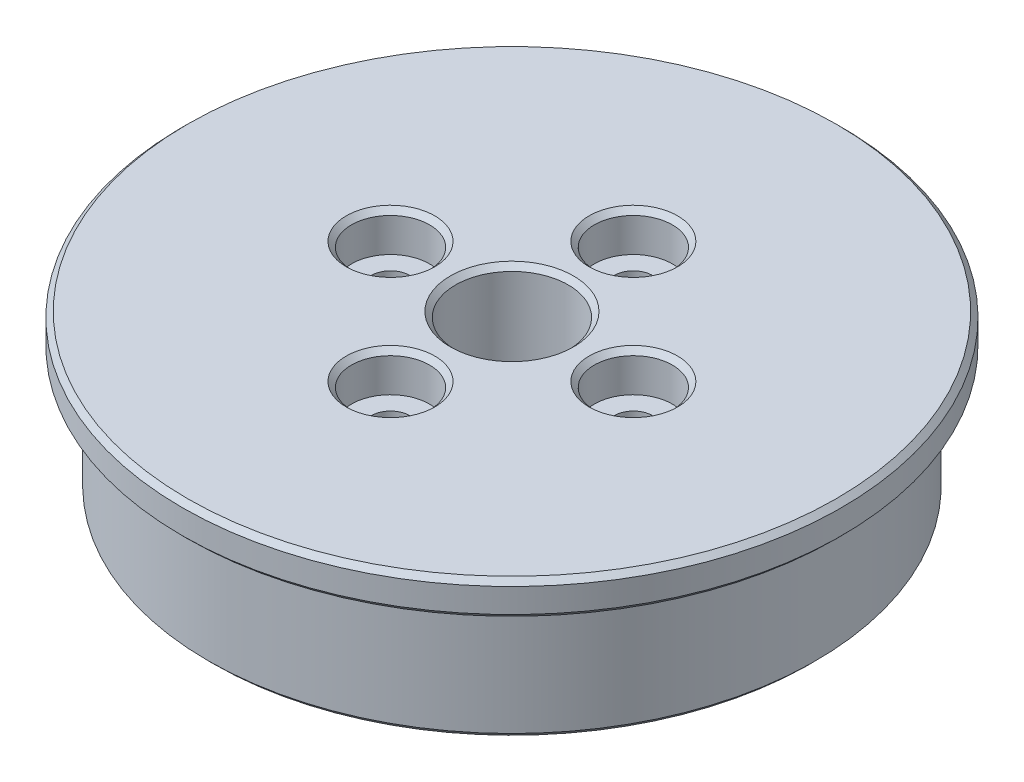
ISO-10303-21;
HEADER;
FILE_DESCRIPTION(('STEP AP214'),'2;1');
FILE_NAME('part.step','',(''),(''),'','','');
FILE_SCHEMA(('AUTOMOTIVE_DESIGN { 1 0 10303 214 1 1 1 1 }'));
ENDSEC;
DATA;
#1=APPLICATION_CONTEXT('core data for automotive mechanical design processes');
#2=APPLICATION_PROTOCOL_DEFINITION('international standard','automotive_design',2000,#1);
#3=PRODUCT_CONTEXT('',#1,'mechanical');
#4=PRODUCT('Part','Part','',(#3));
#5=PRODUCT_RELATED_PRODUCT_CATEGORY('part','',(#4));
#6=PRODUCT_DEFINITION_FORMATION('','',#4);
#7=PRODUCT_DEFINITION_CONTEXT('part definition',#1,'design');
#8=PRODUCT_DEFINITION('design','',#6,#7);
#9=PRODUCT_DEFINITION_SHAPE('','',#8);
#10=(LENGTH_UNIT() NAMED_UNIT(*) SI_UNIT(.MILLI.,.METRE.));
#11=(NAMED_UNIT(*) PLANE_ANGLE_UNIT() SI_UNIT($,.RADIAN.));
#12=(NAMED_UNIT(*) SI_UNIT($,.STERADIAN.) SOLID_ANGLE_UNIT());
#13=UNCERTAINTY_MEASURE_WITH_UNIT(LENGTH_MEASURE(1.E-05),#10,'distance_accuracy_value','');
#14=(GEOMETRIC_REPRESENTATION_CONTEXT(3) GLOBAL_UNCERTAINTY_ASSIGNED_CONTEXT((#13)) GLOBAL_UNIT_ASSIGNED_CONTEXT((#10,
#11,#12)) REPRESENTATION_CONTEXT('',''));
#15=CARTESIAN_POINT('',(0.,0.,0.));
#16=DIRECTION('',(0.,0.,1.));
#17=DIRECTION('',(1.,0.,0.));
#18=AXIS2_PLACEMENT_3D('',#15,#16,#17);
#19=CARTESIAN_POINT('',(0.,1.45,0.));
#20=DIRECTION('',(0.,1.,0.));
#21=DIRECTION('',(0.,0.,1.));
#22=AXIS2_PLACEMENT_3D('',#19,#20,#21);
#23=PLANE('',#22);
#24=CARTESIAN_POINT('',(0.,1.45,0.));
#25=DIRECTION('',(0.,1.,0.));
#26=DIRECTION('',(0.,0.,1.));
#27=AXIS2_PLACEMENT_3D('',#24,#25,#26);
#28=CIRCLE('',#27,17.2);
#29=CARTESIAN_POINT('',(0.,1.45,17.2));
#30=VERTEX_POINT('',#29);
#31=EDGE_CURVE('E42',#30,#30,#28,.F.);
#32=ORIENTED_EDGE('',*,*,#31,.T.);
#33=EDGE_LOOP('',(#32));
#34=FACE_BOUND('',#33,.T.);
#35=CARTESIAN_POINT('',(0.,1.45,0.));
#36=DIRECTION('',(0.,1.,0.));
#37=DIRECTION('',(0.,0.,1.));
#38=AXIS2_PLACEMENT_3D('',#35,#36,#37);
#39=CIRCLE('',#38,16.);
#40=CARTESIAN_POINT('',(0.,1.45,16.));
#41=VERTEX_POINT('',#40);
#42=EDGE_CURVE('E99',#41,#41,#39,.F.);
#43=ORIENTED_EDGE('',*,*,#42,.F.);
#44=EDGE_LOOP('',(#43));
#45=FACE_BOUND('',#44,.T.);
#46=ADVANCED_FACE('F31',(#34,#45),#23,.F.);
#47=CARTESIAN_POINT('',(-7.,10.45,0.));
#48=DIRECTION('',(0.,-1.,0.));
#49=DIRECTION('',(0.,0.,-1.));
#50=AXIS2_PLACEMENT_3D('',#47,#48,#49);
#51=CYLINDRICAL_SURFACE('',#50,1.1);
#52=CARTESIAN_POINT('',(-7.,0.,0.));
#53=DIRECTION('',(0.,1.,0.));
#54=DIRECTION('',(0.,0.,1.));
#55=AXIS2_PLACEMENT_3D('',#52,#53,#54);
#56=CIRCLE('',#55,1.1);
#57=CARTESIAN_POINT('',(-7.,0.,1.1));
#58=VERTEX_POINT('',#57);
#59=EDGE_CURVE('E124',#58,#58,#56,.T.);
#60=ORIENTED_EDGE('',*,*,#59,.F.);
#61=EDGE_LOOP('',(#60));
#62=FACE_BOUND('',#61,.T.);
#63=CARTESIAN_POINT('',(-7.,8.2,0.));
#64=DIRECTION('',(0.,1.,0.));
#65=DIRECTION('',(0.,0.,1.));
#66=AXIS2_PLACEMENT_3D('',#63,#64,#65);
#67=CIRCLE('',#66,1.1);
#68=CARTESIAN_POINT('',(-7.,8.2,1.1));
#69=VERTEX_POINT('',#68);
#70=EDGE_CURVE('E104',#69,#69,#67,.T.);
#71=ORIENTED_EDGE('',*,*,#70,.T.);
#72=EDGE_LOOP('',(#71));
#73=FACE_BOUND('',#72,.T.);
#74=ADVANCED_FACE('F170',(#62,#73),#51,.F.);
#75=CARTESIAN_POINT('',(0.,10.45,-7.));
#76=DIRECTION('',(0.,-1.,0.));
#77=DIRECTION('',(0.,0.,-1.));
#78=AXIS2_PLACEMENT_3D('',#75,#76,#77);
#79=CYLINDRICAL_SURFACE('',#78,1.1);
#80=CARTESIAN_POINT('',(0.,0.,-7.));
#81=DIRECTION('',(0.,1.,0.));
#82=DIRECTION('',(0.,0.,1.));
#83=AXIS2_PLACEMENT_3D('',#80,#81,#82);
#84=CIRCLE('',#83,1.1);
#85=CARTESIAN_POINT('',(0.,0.,-5.9));
#86=VERTEX_POINT('',#85);
#87=EDGE_CURVE('E127',#86,#86,#84,.T.);
#88=ORIENTED_EDGE('',*,*,#87,.F.);
#89=EDGE_LOOP('',(#88));
#90=FACE_BOUND('',#89,.T.);
#91=CARTESIAN_POINT('',(0.,8.2,-7.));
#92=DIRECTION('',(0.,1.,0.));
#93=DIRECTION('',(0.,0.,1.));
#94=AXIS2_PLACEMENT_3D('',#91,#92,#93);
#95=CIRCLE('',#94,1.1);
#96=CARTESIAN_POINT('',(0.,8.2,-5.9));
#97=VERTEX_POINT('',#96);
#98=EDGE_CURVE('E108',#97,#97,#95,.T.);
#99=ORIENTED_EDGE('',*,*,#98,.T.);
#100=EDGE_LOOP('',(#99));
#101=FACE_BOUND('',#100,.T.);
#102=ADVANCED_FACE('F177',(#90,#101),#79,.F.);
#103=CARTESIAN_POINT('',(7.,10.45,0.));
#104=DIRECTION('',(0.,-1.,0.));
#105=DIRECTION('',(0.,0.,-1.));
#106=AXIS2_PLACEMENT_3D('',#103,#104,#105);
#107=CYLINDRICAL_SURFACE('',#106,1.1);
#108=CARTESIAN_POINT('',(7.,0.,0.));
#109=DIRECTION('',(0.,1.,0.));
#110=DIRECTION('',(0.,0.,1.));
#111=AXIS2_PLACEMENT_3D('',#108,#109,#110);
#112=CIRCLE('',#111,1.1);
#113=CARTESIAN_POINT('',(7.,0.,1.1));
#114=VERTEX_POINT('',#113);
#115=EDGE_CURVE('E107',#114,#114,#112,.T.);
#116=ORIENTED_EDGE('',*,*,#115,.F.);
#117=EDGE_LOOP('',(#116));
#118=FACE_BOUND('',#117,.T.);
#119=CARTESIAN_POINT('',(7.,8.2,0.));
#120=DIRECTION('',(0.,1.,0.));
#121=DIRECTION('',(0.,0.,1.));
#122=AXIS2_PLACEMENT_3D('',#119,#120,#121);
#123=CIRCLE('',#122,1.1);
#124=CARTESIAN_POINT('',(7.,8.2,1.1));
#125=VERTEX_POINT('',#124);
#126=EDGE_CURVE('E111',#125,#125,#123,.T.);
#127=ORIENTED_EDGE('',*,*,#126,.T.);
#128=EDGE_LOOP('',(#127));
#129=FACE_BOUND('',#128,.T.);
#130=ADVANCED_FACE('F376',(#118,#129),#107,.F.);
#131=CARTESIAN_POINT('',(0.,10.45,7.));
#132=DIRECTION('',(0.,-1.,0.));
#133=DIRECTION('',(0.,0.,-1.));
#134=AXIS2_PLACEMENT_3D('',#131,#132,#133);
#135=CYLINDRICAL_SURFACE('',#134,1.1);
#136=CARTESIAN_POINT('',(0.,0.,7.));
#137=DIRECTION('',(0.,1.,0.));
#138=DIRECTION('',(0.,0.,1.));
#139=AXIS2_PLACEMENT_3D('',#136,#137,#138);
#140=CIRCLE('',#139,1.1);
#141=CARTESIAN_POINT('',(0.,0.,8.1));
#142=VERTEX_POINT('',#141);
#143=EDGE_CURVE('E123',#142,#142,#140,.T.);
#144=ORIENTED_EDGE('',*,*,#143,.F.);
#145=EDGE_LOOP('',(#144));
#146=FACE_BOUND('',#145,.T.);
#147=CARTESIAN_POINT('',(0.,8.2,7.));
#148=DIRECTION('',(0.,1.,0.));
#149=DIRECTION('',(0.,0.,1.));
#150=AXIS2_PLACEMENT_3D('',#147,#148,#149);
#151=CIRCLE('',#150,1.1);
#152=CARTESIAN_POINT('',(0.,8.2,8.1));
#153=VERTEX_POINT('',#152);
#154=EDGE_CURVE('E114',#153,#153,#151,.T.);
#155=ORIENTED_EDGE('',*,*,#154,.T.);
#156=EDGE_LOOP('',(#155));
#157=FACE_BOUND('',#156,.T.);
#158=ADVANCED_FACE('F189',(#146,#157),#135,.F.);
#159=CARTESIAN_POINT('',(0.,1.45,0.));
#160=DIRECTION('',(0.,-1.,0.));
#161=DIRECTION('',(0.,0.,-1.));
#162=AXIS2_PLACEMENT_3D('',#159,#160,#161);
#163=CYLINDRICAL_SURFACE('',#162,10.);
#164=CARTESIAN_POINT('',(0.,0.,0.));
#165=DIRECTION('',(0.,1.,0.));
#166=DIRECTION('',(0.,0.,1.));
#167=AXIS2_PLACEMENT_3D('',#164,#165,#166);
#168=CIRCLE('',#167,10.);
#169=CARTESIAN_POINT('',(0.,0.,10.));
#170=VERTEX_POINT('',#169);
#171=EDGE_CURVE('E93',#170,#170,#168,.T.);
#172=ORIENTED_EDGE('',*,*,#171,.T.);
#173=EDGE_LOOP('',(#172));
#174=FACE_BOUND('',#173,.T.);
#175=CARTESIAN_POINT('',(0.,2.2,0.));
#176=DIRECTION('',(0.,1.,0.));
#177=DIRECTION('',(0.,0.,1.));
#178=AXIS2_PLACEMENT_3D('',#175,#176,#177);
#179=CIRCLE('',#178,10.);
#180=CARTESIAN_POINT('',(0.,2.2,10.));
#181=VERTEX_POINT('',#180);
#182=EDGE_CURVE('E97',#181,#181,#179,.T.);
#183=ORIENTED_EDGE('',*,*,#182,.F.);
#184=EDGE_LOOP('',(#183));
#185=FACE_BOUND('',#184,.T.);
#186=ADVANCED_FACE('F185',(#174,#185),#163,.T.);
#187=CARTESIAN_POINT('',(0.,0.,0.));
#188=DIRECTION('',(0.,1.,0.));
#189=DIRECTION('',(0.,0.,1.));
#190=AXIS2_PLACEMENT_3D('',#187,#188,#189);
#191=PLANE('',#190);
#192=CARTESIAN_POINT('',(0.,0.,0.));
#193=DIRECTION('',(0.,1.,0.));
#194=DIRECTION('',(0.,0.,1.));
#195=AXIS2_PLACEMENT_3D('',#192,#193,#194);
#196=CIRCLE('',#195,4.80000000000001);
#197=CARTESIAN_POINT('',(0.,0.,4.80000000000001));
#198=VERTEX_POINT('',#197);
#199=EDGE_CURVE('E51',#198,#198,#196,.T.);
#200=ORIENTED_EDGE('',*,*,#199,.T.);
#201=EDGE_LOOP('',(#200));
#202=FACE_BOUND('',#201,.T.);
#203=ORIENTED_EDGE('',*,*,#143,.T.);
#204=EDGE_LOOP('',(#203));
#205=FACE_BOUND('',#204,.T.);
#206=ORIENTED_EDGE('',*,*,#115,.T.);
#207=EDGE_LOOP('',(#206));
#208=FACE_BOUND('',#207,.T.);
#209=ORIENTED_EDGE('',*,*,#87,.T.);
#210=EDGE_LOOP('',(#209));
#211=FACE_BOUND('',#210,.T.);
#212=ORIENTED_EDGE('',*,*,#59,.T.);
#213=EDGE_LOOP('',(#212));
#214=FACE_BOUND('',#213,.T.);
#215=ORIENTED_EDGE('',*,*,#171,.F.);
#216=EDGE_LOOP('',(#215));
#217=FACE_BOUND('',#216,.T.);
#218=ADVANCED_FACE('F188',(#202,#205,#208,#211,#214,#217),#191,.F.);
#219=CARTESIAN_POINT('',(0.,8.45,0.));
#220=DIRECTION('',(0.,1.,0.));
#221=DIRECTION('',(0.,0.,1.));
#222=AXIS2_PLACEMENT_3D('',#219,#220,#221);
#223=PLANE('',#222);
#224=CARTESIAN_POINT('',(0.,8.45,0.));
#225=DIRECTION('',(0.,1.,0.));
#226=DIRECTION('',(0.,0.,1.));
#227=AXIS2_PLACEMENT_3D('',#224,#225,#226);
#228=CIRCLE('',#227,18.7);
#229=CARTESIAN_POINT('',(0.,8.45,18.7));
#230=VERTEX_POINT('',#229);
#231=EDGE_CURVE('E10',#230,#230,#228,.F.);
#232=ORIENTED_EDGE('',*,*,#231,.T.);
#233=EDGE_LOOP('',(#232));
#234=FACE_BOUND('',#233,.T.);
#235=CARTESIAN_POINT('',(0.,8.45,0.));
#236=DIRECTION('',(0.,1.,0.));
#237=DIRECTION('',(0.,0.,1.));
#238=AXIS2_PLACEMENT_3D('',#235,#236,#237);
#239=CIRCLE('',#238,17.5);
#240=CARTESIAN_POINT('',(0.,8.45,17.5));
#241=VERTEX_POINT('',#240);
#242=EDGE_CURVE('E120',#241,#241,#239,.T.);
#243=ORIENTED_EDGE('',*,*,#242,.T.);
#244=EDGE_LOOP('',(#243));
#245=FACE_BOUND('',#244,.T.);
#246=ADVANCED_FACE('F197',(#234,#245),#223,.F.);
#247=CARTESIAN_POINT('',(0.,8.45,0.));
#248=DIRECTION('',(0.,-1.,0.));
#249=DIRECTION('',(0.,0.,-1.));
#250=AXIS2_PLACEMENT_3D('',#247,#248,#249);
#251=CYLINDRICAL_SURFACE('',#250,17.5);
#252=CARTESIAN_POINT('',(0.,1.74999999999999,0.));
#253=DIRECTION('',(0.,1.,0.));
#254=DIRECTION('',(0.,0.,1.));
#255=AXIS2_PLACEMENT_3D('',#252,#253,#254);
#256=CIRCLE('',#255,17.5);
#257=CARTESIAN_POINT('',(0.,1.74999999999999,17.5));
#258=VERTEX_POINT('',#257);
#259=EDGE_CURVE('E38',#258,#258,#256,.T.);
#260=ORIENTED_EDGE('',*,*,#259,.T.);
#261=EDGE_LOOP('',(#260));
#262=FACE_BOUND('',#261,.T.);
#263=ORIENTED_EDGE('',*,*,#242,.F.);
#264=EDGE_LOOP('',(#263));
#265=FACE_BOUND('',#264,.T.);
#266=ADVANCED_FACE('F183',(#262,#265),#251,.T.);
#267=CARTESIAN_POINT('',(0.,10.45,0.));
#268=DIRECTION('',(0.,1.,0.));
#269=DIRECTION('',(0.,0.,1.));
#270=AXIS2_PLACEMENT_3D('',#267,#268,#269);
#271=PLANE('',#270);
#272=CARTESIAN_POINT('',(0.,10.45,0.));
#273=DIRECTION('',(0.,1.,0.));
#274=DIRECTION('',(0.,0.,1.));
#275=AXIS2_PLACEMENT_3D('',#272,#273,#274);
#276=CIRCLE('',#275,18.7);
#277=CARTESIAN_POINT('',(0.,10.45,18.7));
#278=VERTEX_POINT('',#277);
#279=EDGE_CURVE('E75',#278,#278,#276,.T.);
#280=ORIENTED_EDGE('',*,*,#279,.T.);
#281=EDGE_LOOP('',(#280));
#282=FACE_BOUND('',#281,.T.);
#283=CARTESIAN_POINT('',(0.,10.45,0.));
#284=DIRECTION('',(0.,1.,0.));
#285=DIRECTION('',(0.,0.,1.));
#286=AXIS2_PLACEMENT_3D('',#283,#284,#285);
#287=CIRCLE('',#286,3.55);
#288=CARTESIAN_POINT('',(0.,10.45,3.55));
#289=VERTEX_POINT('',#288);
#290=EDGE_CURVE('E78',#289,#289,#287,.F.);
#291=ORIENTED_EDGE('',*,*,#290,.T.);
#292=EDGE_LOOP('',(#291));
#293=FACE_BOUND('',#292,.T.);
#294=CARTESIAN_POINT('',(0.,10.45,7.));
#295=DIRECTION('',(0.,1.,0.));
#296=DIRECTION('',(0.,0.,1.));
#297=AXIS2_PLACEMENT_3D('',#294,#295,#296);
#298=CIRCLE('',#297,2.55);
#299=CARTESIAN_POINT('',(0.,10.45,9.55));
#300=VERTEX_POINT('',#299);
#301=EDGE_CURVE('E81',#300,#300,#298,.F.);
#302=ORIENTED_EDGE('',*,*,#301,.T.);
#303=EDGE_LOOP('',(#302));
#304=FACE_BOUND('',#303,.T.);
#305=CARTESIAN_POINT('',(7.,10.45,0.));
#306=DIRECTION('',(0.,1.,0.));
#307=DIRECTION('',(0.,0.,1.));
#308=AXIS2_PLACEMENT_3D('',#305,#306,#307);
#309=CIRCLE('',#308,2.55);
#310=CARTESIAN_POINT('',(7.,10.45,2.55));
#311=VERTEX_POINT('',#310);
#312=EDGE_CURVE('E84',#311,#311,#309,.F.);
#313=ORIENTED_EDGE('',*,*,#312,.T.);
#314=EDGE_LOOP('',(#313));
#315=FACE_BOUND('',#314,.T.);
#316=CARTESIAN_POINT('',(0.,10.45,-7.));
#317=DIRECTION('',(0.,1.,0.));
#318=DIRECTION('',(0.,0.,1.));
#319=AXIS2_PLACEMENT_3D('',#316,#317,#318);
#320=CIRCLE('',#319,2.55000000000001);
#321=CARTESIAN_POINT('',(0.,10.45,-4.44999999999999));
#322=VERTEX_POINT('',#321);
#323=EDGE_CURVE('E87',#322,#322,#320,.F.);
#324=ORIENTED_EDGE('',*,*,#323,.T.);
#325=EDGE_LOOP('',(#324));
#326=FACE_BOUND('',#325,.T.);
#327=CARTESIAN_POINT('',(-7.,10.45,0.));
#328=DIRECTION('',(0.,1.,0.));
#329=DIRECTION('',(0.,0.,1.));
#330=AXIS2_PLACEMENT_3D('',#327,#328,#329);
#331=CIRCLE('',#330,2.55);
#332=CARTESIAN_POINT('',(-7.,10.45,2.55));
#333=VERTEX_POINT('',#332);
#334=EDGE_CURVE('E90',#333,#333,#331,.F.);
#335=ORIENTED_EDGE('',*,*,#334,.T.);
#336=EDGE_LOOP('',(#335));
#337=FACE_BOUND('',#336,.T.);
#338=ADVANCED_FACE('F191',(#282,#293,#304,#315,#326,#337),#271,.T.);
#339=CARTESIAN_POINT('',(0.,10.45,0.));
#340=DIRECTION('',(0.,-1.,0.));
#341=DIRECTION('',(0.,0.,-1.));
#342=AXIS2_PLACEMENT_3D('',#339,#340,#341);
#343=CYLINDRICAL_SURFACE('',#342,19.);
#344=CARTESIAN_POINT('',(0.,10.15,0.));
#345=DIRECTION('',(0.,1.,0.));
#346=DIRECTION('',(0.,0.,1.));
#347=AXIS2_PLACEMENT_3D('',#344,#345,#346);
#348=CIRCLE('',#347,19.);
#349=CARTESIAN_POINT('',(0.,10.15,19.));
#350=VERTEX_POINT('',#349);
#351=EDGE_CURVE('E69',#350,#350,#348,.F.);
#352=ORIENTED_EDGE('',*,*,#351,.T.);
#353=EDGE_LOOP('',(#352));
#354=FACE_BOUND('',#353,.T.);
#355=CARTESIAN_POINT('',(0.,8.74999999999999,0.));
#356=DIRECTION('',(0.,1.,0.));
#357=DIRECTION('',(0.,0.,1.));
#358=AXIS2_PLACEMENT_3D('',#355,#356,#357);
#359=CIRCLE('',#358,19.);
#360=CARTESIAN_POINT('',(0.,8.74999999999999,19.));
#361=VERTEX_POINT('',#360);
#362=EDGE_CURVE('E72',#361,#361,#359,.T.);
#363=ORIENTED_EDGE('',*,*,#362,.T.);
#364=EDGE_LOOP('',(#363));
#365=FACE_BOUND('',#364,.T.);
#366=ADVANCED_FACE('F194',(#354,#365),#343,.T.);
#367=CARTESIAN_POINT('',(0.,10.45,0.));
#368=DIRECTION('',(0.,-1.,0.));
#369=DIRECTION('',(0.,0.,-1.));
#370=AXIS2_PLACEMENT_3D('',#367,#368,#369);
#371=CYLINDRICAL_SURFACE('',#370,3.25);
#372=CARTESIAN_POINT('',(0.,10.15,0.));
#373=DIRECTION('',(0.,1.,0.));
#374=DIRECTION('',(0.,0.,1.));
#375=AXIS2_PLACEMENT_3D('',#372,#373,#374);
#376=CIRCLE('',#375,3.25);
#377=CARTESIAN_POINT('',(0.,10.15,3.25));
#378=VERTEX_POINT('',#377);
#379=EDGE_CURVE('E66',#378,#378,#376,.T.);
#380=ORIENTED_EDGE('',*,*,#379,.T.);
#381=EDGE_LOOP('',(#380));
#382=FACE_BOUND('',#381,.T.);
#383=CARTESIAN_POINT('',(0.,2.,0.));
#384=DIRECTION('',(0.,1.,0.));
#385=DIRECTION('',(0.,0.,1.));
#386=AXIS2_PLACEMENT_3D('',#383,#384,#385);
#387=CIRCLE('',#386,3.25);
#388=CARTESIAN_POINT('',(0.,2.,3.25));
#389=VERTEX_POINT('',#388);
#390=EDGE_CURVE('E94',#389,#389,#387,.T.);
#391=ORIENTED_EDGE('',*,*,#390,.F.);
#392=EDGE_LOOP('',(#391));
#393=FACE_BOUND('',#392,.T.);
#394=ADVANCED_FACE('F200',(#382,#393),#371,.F.);
#395=CARTESIAN_POINT('',(0.,10.45,7.));
#396=DIRECTION('',(0.,-1.,0.));
#397=DIRECTION('',(0.,0.,-1.));
#398=AXIS2_PLACEMENT_3D('',#395,#396,#397);
#399=CYLINDRICAL_SURFACE('',#398,2.25);
#400=CARTESIAN_POINT('',(0.,10.15,7.));
#401=DIRECTION('',(0.,1.,0.));
#402=DIRECTION('',(0.,0.,1.));
#403=AXIS2_PLACEMENT_3D('',#400,#401,#402);
#404=CIRCLE('',#403,2.25);
#405=CARTESIAN_POINT('',(0.,10.15,9.25));
#406=VERTEX_POINT('',#405);
#407=EDGE_CURVE('E63',#406,#406,#404,.T.);
#408=ORIENTED_EDGE('',*,*,#407,.T.);
#409=EDGE_LOOP('',(#408));
#410=FACE_BOUND('',#409,.T.);
#411=CARTESIAN_POINT('',(0.,8.2,7.));
#412=DIRECTION('',(0.,1.,0.));
#413=DIRECTION('',(0.,0.,1.));
#414=AXIS2_PLACEMENT_3D('',#411,#412,#413);
#415=CIRCLE('',#414,2.25);
#416=CARTESIAN_POINT('',(0.,8.2,9.25));
#417=VERTEX_POINT('',#416);
#418=EDGE_CURVE('E102',#417,#417,#415,.T.);
#419=ORIENTED_EDGE('',*,*,#418,.F.);
#420=EDGE_LOOP('',(#419));
#421=FACE_BOUND('',#420,.T.);
#422=ADVANCED_FACE('F327',(#410,#421),#399,.F.);
#423=CARTESIAN_POINT('',(0.,8.2,7.));
#424=DIRECTION('',(0.,1.,0.));
#425=DIRECTION('',(0.,0.,1.));
#426=AXIS2_PLACEMENT_3D('',#423,#424,#425);
#427=PLANE('',#426);
#428=ORIENTED_EDGE('',*,*,#154,.F.);
#429=EDGE_LOOP('',(#428));
#430=FACE_BOUND('',#429,.T.);
#431=ORIENTED_EDGE('',*,*,#418,.T.);
#432=EDGE_LOOP('',(#431));
#433=FACE_BOUND('',#432,.T.);
#434=ADVANCED_FACE('F321',(#430,#433),#427,.T.);
#435=CARTESIAN_POINT('',(7.,10.45,0.));
#436=DIRECTION('',(0.,-1.,0.));
#437=DIRECTION('',(0.,0.,-1.));
#438=AXIS2_PLACEMENT_3D('',#435,#436,#437);
#439=CYLINDRICAL_SURFACE('',#438,2.25);
#440=CARTESIAN_POINT('',(7.,10.15,0.));
#441=DIRECTION('',(0.,1.,0.));
#442=DIRECTION('',(0.,0.,1.));
#443=AXIS2_PLACEMENT_3D('',#440,#441,#442);
#444=CIRCLE('',#443,2.25);
#445=CARTESIAN_POINT('',(7.,10.15,2.25));
#446=VERTEX_POINT('',#445);
#447=EDGE_CURVE('E60',#446,#446,#444,.T.);
#448=ORIENTED_EDGE('',*,*,#447,.T.);
#449=EDGE_LOOP('',(#448));
#450=FACE_BOUND('',#449,.T.);
#451=CARTESIAN_POINT('',(7.,8.2,0.));
#452=DIRECTION('',(0.,1.,0.));
#453=DIRECTION('',(0.,0.,1.));
#454=AXIS2_PLACEMENT_3D('',#451,#452,#453);
#455=CIRCLE('',#454,2.25);
#456=CARTESIAN_POINT('',(7.,8.2,2.25));
#457=VERTEX_POINT('',#456);
#458=EDGE_CURVE('E136',#457,#457,#455,.T.);
#459=ORIENTED_EDGE('',*,*,#458,.F.);
#460=EDGE_LOOP('',(#459));
#461=FACE_BOUND('',#460,.T.);
#462=ADVANCED_FACE('F317',(#450,#461),#439,.F.);
#463=CARTESIAN_POINT('',(7.,8.2,0.));
#464=DIRECTION('',(0.,1.,0.));
#465=DIRECTION('',(0.,0.,1.));
#466=AXIS2_PLACEMENT_3D('',#463,#464,#465);
#467=PLANE('',#466);
#468=ORIENTED_EDGE('',*,*,#126,.F.);
#469=EDGE_LOOP('',(#468));
#470=FACE_BOUND('',#469,.T.);
#471=ORIENTED_EDGE('',*,*,#458,.T.);
#472=EDGE_LOOP('',(#471));
#473=FACE_BOUND('',#472,.T.);
#474=ADVANCED_FACE('F311',(#470,#473),#467,.T.);
#475=CARTESIAN_POINT('',(0.,10.45,-7.));
#476=DIRECTION('',(0.,-1.,0.));
#477=DIRECTION('',(0.,0.,-1.));
#478=AXIS2_PLACEMENT_3D('',#475,#476,#477);
#479=CYLINDRICAL_SURFACE('',#478,2.25);
#480=CARTESIAN_POINT('',(0.,10.15,-7.));
#481=DIRECTION('',(0.,1.,0.));
#482=DIRECTION('',(0.,0.,1.));
#483=AXIS2_PLACEMENT_3D('',#480,#481,#482);
#484=CIRCLE('',#483,2.25);
#485=CARTESIAN_POINT('',(0.,10.15,-4.75));
#486=VERTEX_POINT('',#485);
#487=EDGE_CURVE('E57',#486,#486,#484,.T.);
#488=ORIENTED_EDGE('',*,*,#487,.T.);
#489=EDGE_LOOP('',(#488));
#490=FACE_BOUND('',#489,.T.);
#491=CARTESIAN_POINT('',(0.,8.2,-7.));
#492=DIRECTION('',(0.,1.,0.));
#493=DIRECTION('',(0.,0.,1.));
#494=AXIS2_PLACEMENT_3D('',#491,#492,#493);
#495=CIRCLE('',#494,2.25);
#496=CARTESIAN_POINT('',(0.,8.2,-4.75));
#497=VERTEX_POINT('',#496);
#498=EDGE_CURVE('E139',#497,#497,#495,.T.);
#499=ORIENTED_EDGE('',*,*,#498,.F.);
#500=EDGE_LOOP('',(#499));
#501=FACE_BOUND('',#500,.T.);
#502=ADVANCED_FACE('F307',(#490,#501),#479,.F.);
#503=CARTESIAN_POINT('',(0.,8.2,-7.));
#504=DIRECTION('',(0.,1.,0.));
#505=DIRECTION('',(0.,0.,1.));
#506=AXIS2_PLACEMENT_3D('',#503,#504,#505);
#507=PLANE('',#506);
#508=ORIENTED_EDGE('',*,*,#98,.F.);
#509=EDGE_LOOP('',(#508));
#510=FACE_BOUND('',#509,.T.);
#511=ORIENTED_EDGE('',*,*,#498,.T.);
#512=EDGE_LOOP('',(#511));
#513=FACE_BOUND('',#512,.T.);
#514=ADVANCED_FACE('F300',(#510,#513),#507,.T.);
#515=CARTESIAN_POINT('',(-7.,10.45,0.));
#516=DIRECTION('',(0.,-1.,0.));
#517=DIRECTION('',(0.,0.,-1.));
#518=AXIS2_PLACEMENT_3D('',#515,#516,#517);
#519=CYLINDRICAL_SURFACE('',#518,2.25);
#520=CARTESIAN_POINT('',(-7.,10.15,0.));
#521=DIRECTION('',(0.,1.,0.));
#522=DIRECTION('',(0.,0.,1.));
#523=AXIS2_PLACEMENT_3D('',#520,#521,#522);
#524=CIRCLE('',#523,2.25);
#525=CARTESIAN_POINT('',(-7.,10.15,2.25));
#526=VERTEX_POINT('',#525);
#527=EDGE_CURVE('E54',#526,#526,#524,.T.);
#528=ORIENTED_EDGE('',*,*,#527,.T.);
#529=EDGE_LOOP('',(#528));
#530=FACE_BOUND('',#529,.T.);
#531=CARTESIAN_POINT('',(-7.,8.2,0.));
#532=DIRECTION('',(0.,1.,0.));
#533=DIRECTION('',(0.,0.,1.));
#534=AXIS2_PLACEMENT_3D('',#531,#532,#533);
#535=CIRCLE('',#534,2.25);
#536=CARTESIAN_POINT('',(-7.,8.2,2.25));
#537=VERTEX_POINT('',#536);
#538=EDGE_CURVE('E117',#537,#537,#535,.T.);
#539=ORIENTED_EDGE('',*,*,#538,.F.);
#540=EDGE_LOOP('',(#539));
#541=FACE_BOUND('',#540,.T.);
#542=ADVANCED_FACE('F295',(#530,#541),#519,.F.);
#543=CARTESIAN_POINT('',(-7.,8.2,0.));
#544=DIRECTION('',(0.,1.,0.));
#545=DIRECTION('',(0.,0.,1.));
#546=AXIS2_PLACEMENT_3D('',#543,#544,#545);
#547=PLANE('',#546);
#548=ORIENTED_EDGE('',*,*,#70,.F.);
#549=EDGE_LOOP('',(#548));
#550=FACE_BOUND('',#549,.T.);
#551=ORIENTED_EDGE('',*,*,#538,.T.);
#552=EDGE_LOOP('',(#551));
#553=FACE_BOUND('',#552,.T.);
#554=ADVANCED_FACE('F299',(#550,#553),#547,.T.);
#555=CARTESIAN_POINT('',(0.,2.2,0.));
#556=DIRECTION('',(0.,-1.,0.));
#557=DIRECTION('',(0.,0.,-1.));
#558=AXIS2_PLACEMENT_3D('',#555,#556,#557);
#559=CYLINDRICAL_SURFACE('',#558,16.);
#560=CARTESIAN_POINT('',(0.,2.2,0.));
#561=DIRECTION('',(0.,1.,0.));
#562=DIRECTION('',(0.,0.,1.));
#563=AXIS2_PLACEMENT_3D('',#560,#561,#562);
#564=CIRCLE('',#563,16.);
#565=CARTESIAN_POINT('',(0.,2.2,16.));
#566=VERTEX_POINT('',#565);
#567=EDGE_CURVE('E103',#566,#566,#564,.T.);
#568=ORIENTED_EDGE('',*,*,#567,.T.);
#569=EDGE_LOOP('',(#568));
#570=FACE_BOUND('',#569,.T.);
#571=ORIENTED_EDGE('',*,*,#42,.T.);
#572=EDGE_LOOP('',(#571));
#573=FACE_BOUND('',#572,.T.);
#574=ADVANCED_FACE('F412',(#570,#573),#559,.F.);
#575=CARTESIAN_POINT('',(0.,2.2,0.));
#576=DIRECTION('',(0.,1.,0.));
#577=DIRECTION('',(0.,0.,1.));
#578=AXIS2_PLACEMENT_3D('',#575,#576,#577);
#579=PLANE('',#578);
#580=ORIENTED_EDGE('',*,*,#567,.F.);
#581=EDGE_LOOP('',(#580));
#582=FACE_BOUND('',#581,.T.);
#583=ORIENTED_EDGE('',*,*,#182,.T.);
#584=EDGE_LOOP('',(#583));
#585=FACE_BOUND('',#584,.T.);
#586=ADVANCED_FACE('F166',(#582,#585),#579,.F.);
#587=CARTESIAN_POINT('',(0.,2.,0.));
#588=DIRECTION('',(0.,-1.,0.));
#589=DIRECTION('',(0.,0.,-1.));
#590=AXIS2_PLACEMENT_3D('',#587,#588,#589);
#591=CYLINDRICAL_SURFACE('',#590,4.5);
#592=CARTESIAN_POINT('',(0.,0.30000000000001,0.));
#593=DIRECTION('',(0.,1.,0.));
#594=DIRECTION('',(0.,0.,1.));
#595=AXIS2_PLACEMENT_3D('',#592,#593,#594);
#596=CIRCLE('',#595,4.5);
#597=CARTESIAN_POINT('',(0.,0.30000000000001,4.5));
#598=VERTEX_POINT('',#597);
#599=EDGE_CURVE('E46',#598,#598,#596,.F.);
#600=ORIENTED_EDGE('',*,*,#599,.T.);
#601=EDGE_LOOP('',(#600));
#602=FACE_BOUND('',#601,.T.);
#603=CARTESIAN_POINT('',(0.,2.,0.));
#604=DIRECTION('',(0.,1.,0.));
#605=DIRECTION('',(0.,0.,1.));
#606=AXIS2_PLACEMENT_3D('',#603,#604,#605);
#607=CIRCLE('',#606,4.5);
#608=CARTESIAN_POINT('',(0.,2.,4.5));
#609=VERTEX_POINT('',#608);
#610=EDGE_CURVE('E98',#609,#609,#607,.T.);
#611=ORIENTED_EDGE('',*,*,#610,.T.);
#612=EDGE_LOOP('',(#611));
#613=FACE_BOUND('',#612,.T.);
#614=ADVANCED_FACE('F151',(#602,#613),#591,.F.);
#615=CARTESIAN_POINT('',(0.,2.,0.));
#616=DIRECTION('',(0.,1.,0.));
#617=DIRECTION('',(0.,0.,1.));
#618=AXIS2_PLACEMENT_3D('',#615,#616,#617);
#619=PLANE('',#618);
#620=ORIENTED_EDGE('',*,*,#390,.T.);
#621=EDGE_LOOP('',(#620));
#622=FACE_BOUND('',#621,.T.);
#623=ORIENTED_EDGE('',*,*,#610,.F.);
#624=EDGE_LOOP('',(#623));
#625=FACE_BOUND('',#624,.T.);
#626=ADVANCED_FACE('F153',(#622,#625),#619,.F.);
#627=CARTESIAN_POINT('',(0.,10.45,0.));
#628=DIRECTION('',(0.,-1.,0.));
#629=DIRECTION('',(0.,0.,-1.));
#630=AXIS2_PLACEMENT_3D('',#627,#628,#629);
#631=CONICAL_SURFACE('',#630,18.7,0.785398163397443);
#632=ORIENTED_EDGE('',*,*,#351,.F.);
#633=EDGE_LOOP('',(#632));
#634=FACE_BOUND('',#633,.T.);
#635=ORIENTED_EDGE('',*,*,#279,.F.);
#636=EDGE_LOOP('',(#635));
#637=FACE_BOUND('',#636,.T.);
#638=ADVANCED_FACE('F155',(#634,#637),#631,.T.);
#639=CARTESIAN_POINT('',(0.,10.15,0.));
#640=DIRECTION('',(0.,1.,0.));
#641=DIRECTION('',(0.,0.,1.));
#642=AXIS2_PLACEMENT_3D('',#639,#640,#641);
#643=CONICAL_SURFACE('',#642,3.25,0.78539816339745);
#644=ORIENTED_EDGE('',*,*,#290,.F.);
#645=EDGE_LOOP('',(#644));
#646=FACE_BOUND('',#645,.T.);
#647=ORIENTED_EDGE('',*,*,#379,.F.);
#648=EDGE_LOOP('',(#647));
#649=FACE_BOUND('',#648,.T.);
#650=ADVANCED_FACE('F162',(#646,#649),#643,.F.);
#651=CARTESIAN_POINT('',(0.,10.15,7.));
#652=DIRECTION('',(0.,1.,0.));
#653=DIRECTION('',(0.,0.,1.));
#654=AXIS2_PLACEMENT_3D('',#651,#652,#653);
#655=CONICAL_SURFACE('',#654,2.25,0.78539816339745);
#656=ORIENTED_EDGE('',*,*,#301,.F.);
#657=EDGE_LOOP('',(#656));
#658=FACE_BOUND('',#657,.T.);
#659=ORIENTED_EDGE('',*,*,#407,.F.);
#660=EDGE_LOOP('',(#659));
#661=FACE_BOUND('',#660,.T.);
#662=ADVANCED_FACE('F205',(#658,#661),#655,.F.);
#663=CARTESIAN_POINT('',(7.,10.15,0.));
#664=DIRECTION('',(0.,1.,0.));
#665=DIRECTION('',(0.,0.,1.));
#666=AXIS2_PLACEMENT_3D('',#663,#664,#665);
#667=CONICAL_SURFACE('',#666,2.25,0.785398163397452);
#668=ORIENTED_EDGE('',*,*,#312,.F.);
#669=EDGE_LOOP('',(#668));
#670=FACE_BOUND('',#669,.T.);
#671=ORIENTED_EDGE('',*,*,#447,.F.);
#672=EDGE_LOOP('',(#671));
#673=FACE_BOUND('',#672,.T.);
#674=ADVANCED_FACE('F209',(#670,#673),#667,.F.);
#675=CARTESIAN_POINT('',(0.,10.15,-7.));
#676=DIRECTION('',(0.,1.,0.));
#677=DIRECTION('',(0.,0.,1.));
#678=AXIS2_PLACEMENT_3D('',#675,#676,#677);
#679=CONICAL_SURFACE('',#678,2.25,0.785398163397439);
#680=ORIENTED_EDGE('',*,*,#323,.F.);
#681=EDGE_LOOP('',(#680));
#682=FACE_BOUND('',#681,.T.);
#683=ORIENTED_EDGE('',*,*,#487,.F.);
#684=EDGE_LOOP('',(#683));
#685=FACE_BOUND('',#684,.T.);
#686=ADVANCED_FACE('F213',(#682,#685),#679,.F.);
#687=CARTESIAN_POINT('',(-7.,10.15,0.));
#688=DIRECTION('',(0.,1.,0.));
#689=DIRECTION('',(0.,0.,1.));
#690=AXIS2_PLACEMENT_3D('',#687,#688,#689);
#691=CONICAL_SURFACE('',#690,2.25,0.785398163397452);
#692=ORIENTED_EDGE('',*,*,#334,.F.);
#693=EDGE_LOOP('',(#692));
#694=FACE_BOUND('',#693,.T.);
#695=ORIENTED_EDGE('',*,*,#527,.F.);
#696=EDGE_LOOP('',(#695));
#697=FACE_BOUND('',#696,.T.);
#698=ADVANCED_FACE('F217',(#694,#697),#691,.F.);
#699=CARTESIAN_POINT('',(0.,0.,0.));
#700=DIRECTION('',(0.,-1.,0.));
#701=DIRECTION('',(0.,0.,-1.));
#702=AXIS2_PLACEMENT_3D('',#699,#700,#701);
#703=CONICAL_SURFACE('',#702,4.80000000000001,0.785398163397453);
#704=ORIENTED_EDGE('',*,*,#599,.F.);
#705=EDGE_LOOP('',(#704));
#706=FACE_BOUND('',#705,.T.);
#707=ORIENTED_EDGE('',*,*,#199,.F.);
#708=EDGE_LOOP('',(#707));
#709=FACE_BOUND('',#708,.T.);
#710=ADVANCED_FACE('F221',(#706,#709),#703,.F.);
#711=CARTESIAN_POINT('',(0.,1.45,0.));
#712=DIRECTION('',(0.,1.,0.));
#713=DIRECTION('',(0.,0.,1.));
#714=AXIS2_PLACEMENT_3D('',#711,#712,#713);
#715=CONICAL_SURFACE('',#714,17.2,0.785398163397443);
#716=ORIENTED_EDGE('',*,*,#259,.F.);
#717=EDGE_LOOP('',(#716));
#718=FACE_BOUND('',#717,.T.);
#719=ORIENTED_EDGE('',*,*,#31,.F.);
#720=EDGE_LOOP('',(#719));
#721=FACE_BOUND('',#720,.T.);
#722=ADVANCED_FACE('F224',(#718,#721),#715,.T.);
#723=CARTESIAN_POINT('',(0.,8.74999999999999,0.));
#724=DIRECTION('',(0.,1.,0.));
#725=DIRECTION('',(0.,0.,1.));
#726=AXIS2_PLACEMENT_3D('',#723,#724,#725);
#727=CONICAL_SURFACE('',#726,19.,0.78539816339746);
#728=ORIENTED_EDGE('',*,*,#231,.F.);
#729=EDGE_LOOP('',(#728));
#730=FACE_BOUND('',#729,.T.);
#731=ORIENTED_EDGE('',*,*,#362,.F.);
#732=EDGE_LOOP('',(#731));
#733=FACE_BOUND('',#732,.T.);
#734=ADVANCED_FACE('F33',(#730,#733),#727,.T.);
#735=CLOSED_SHELL('',(#46,#74,#102,#130,#158,#186,#218,#246,#266,#338,#366,#394,#422,#434,#462,
#474,#502,#514,#542,#554,#574,#586,#614,#626,#638,#650,#662,#674,#686,#698,#710,#722,#734));
#736=MANIFOLD_SOLID_BREP('B2',#735);
#737=ADVANCED_BREP_SHAPE_REPRESENTATION('',(#18,#736),#14);
#738=SHAPE_DEFINITION_REPRESENTATION(#9,#737);
ENDSEC;
END-ISO-10303-21;
